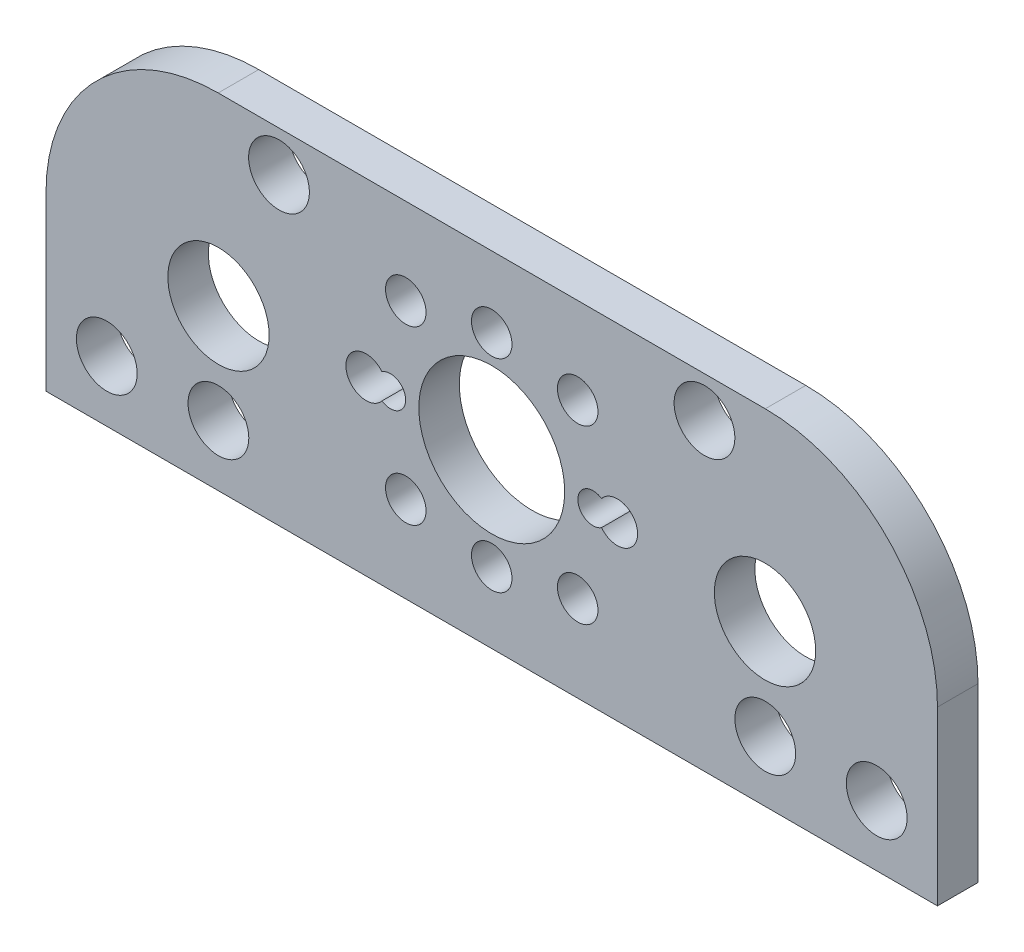
ISO-10303-21;
HEADER;
FILE_DESCRIPTION(('STEP AP214'),'2;1');
FILE_NAME('part.step','',(''),(''),'','','');
FILE_SCHEMA(('AUTOMOTIVE_DESIGN { 1 0 10303 214 1 1 1 1 }'));
ENDSEC;
DATA;
#1=APPLICATION_CONTEXT('core data for automotive mechanical design processes');
#2=APPLICATION_PROTOCOL_DEFINITION('international standard','automotive_design',2000,#1);
#3=PRODUCT_CONTEXT('',#1,'mechanical');
#4=PRODUCT('Part','Part','',(#3));
#5=PRODUCT_RELATED_PRODUCT_CATEGORY('part','',(#4));
#6=PRODUCT_DEFINITION_FORMATION('','',#4);
#7=PRODUCT_DEFINITION_CONTEXT('part definition',#1,'design');
#8=PRODUCT_DEFINITION('design','',#6,#7);
#9=PRODUCT_DEFINITION_SHAPE('','',#8);
#10=(LENGTH_UNIT() NAMED_UNIT(*) SI_UNIT(.MILLI.,.METRE.));
#11=(NAMED_UNIT(*) PLANE_ANGLE_UNIT() SI_UNIT($,.RADIAN.));
#12=(NAMED_UNIT(*) SI_UNIT($,.STERADIAN.) SOLID_ANGLE_UNIT());
#13=UNCERTAINTY_MEASURE_WITH_UNIT(LENGTH_MEASURE(1.E-05),#10,'distance_accuracy_value','');
#14=(GEOMETRIC_REPRESENTATION_CONTEXT(3) GLOBAL_UNCERTAINTY_ASSIGNED_CONTEXT((#13)) GLOBAL_UNIT_ASSIGNED_CONTEXT((#10,
#11,#12)) REPRESENTATION_CONTEXT('',''));
#15=CARTESIAN_POINT('',(0.,0.,0.));
#16=DIRECTION('',(0.,0.,1.));
#17=DIRECTION('',(1.,0.,0.));
#18=AXIS2_PLACEMENT_3D('',#15,#16,#17);
#19=CARTESIAN_POINT('',(22.,0.,-2.));
#20=DIRECTION('',(1.,0.,0.));
#21=DIRECTION('',(0.,1.,0.));
#22=AXIS2_PLACEMENT_3D('',#19,#20,#21);
#23=PLANE('',#22);
#24=DIRECTION('',(0.,1.,0.));
#25=VECTOR('',#24,1.);
#26=CARTESIAN_POINT('',(22.,0.,0.));
#27=LINE('',#26,#25);
#28=CARTESIAN_POINT('',(22.,-8.5,0.));
#29=VERTEX_POINT('',#28);
#30=CARTESIAN_POINT('',(22.,0.,0.));
#31=VERTEX_POINT('',#30);
#32=EDGE_CURVE('E156',#29,#31,#27,.T.);
#33=ORIENTED_EDGE('',*,*,#32,.F.);
#34=DIRECTION('',(0.,0.,1.));
#35=VECTOR('',#34,1.);
#36=CARTESIAN_POINT('',(22.,-8.5,-2.));
#37=LINE('',#36,#35);
#38=CARTESIAN_POINT('',(22.,-8.5,-2.));
#39=VERTEX_POINT('',#38);
#40=EDGE_CURVE('E11',#39,#29,#37,.T.);
#41=ORIENTED_EDGE('',*,*,#40,.F.);
#42=DIRECTION('',(0.,1.,0.));
#43=VECTOR('',#42,1.);
#44=CARTESIAN_POINT('',(22.,0.,-2.));
#45=LINE('',#44,#43);
#46=CARTESIAN_POINT('',(22.,0.,-2.));
#47=VERTEX_POINT('',#46);
#48=EDGE_CURVE('E159',#39,#47,#45,.T.);
#49=ORIENTED_EDGE('',*,*,#48,.T.);
#50=DIRECTION('',(0.,0.,1.));
#51=VECTOR('',#50,1.);
#52=CARTESIAN_POINT('',(22.,0.,-2.));
#53=LINE('',#52,#51);
#54=EDGE_CURVE('E44',#47,#31,#53,.T.);
#55=ORIENTED_EDGE('',*,*,#54,.T.);
#56=EDGE_LOOP('',(#33,#41,#49,#55));
#57=FACE_BOUND('',#56,.T.);
#58=ADVANCED_FACE('F41',(#57),#23,.T.);
#59=CARTESIAN_POINT('',(-22.,-8.5,-2.));
#60=DIRECTION('',(0.,-1.,0.));
#61=DIRECTION('',(0.,0.,-1.));
#62=AXIS2_PLACEMENT_3D('',#59,#60,#61);
#63=PLANE('',#62);
#64=DIRECTION('',(1.,0.,0.));
#65=VECTOR('',#64,1.);
#66=CARTESIAN_POINT('',(-22.,-8.5,0.));
#67=LINE('',#66,#65);
#68=CARTESIAN_POINT('',(-22.,-8.5,0.));
#69=VERTEX_POINT('',#68);
#70=EDGE_CURVE('E163',#69,#29,#67,.T.);
#71=ORIENTED_EDGE('',*,*,#70,.F.);
#72=DIRECTION('',(0.,0.,1.));
#73=VECTOR('',#72,1.);
#74=CARTESIAN_POINT('',(-22.,-8.5,-2.));
#75=LINE('',#74,#73);
#76=CARTESIAN_POINT('',(-22.,-8.5,-2.));
#77=VERTEX_POINT('',#76);
#78=EDGE_CURVE('E49',#77,#69,#75,.T.);
#79=ORIENTED_EDGE('',*,*,#78,.F.);
#80=DIRECTION('',(1.,0.,0.));
#81=VECTOR('',#80,1.);
#82=CARTESIAN_POINT('',(-22.,-8.5,-2.));
#83=LINE('',#82,#81);
#84=EDGE_CURVE('E175',#77,#39,#83,.T.);
#85=ORIENTED_EDGE('',*,*,#84,.T.);
#86=ORIENTED_EDGE('',*,*,#40,.T.);
#87=EDGE_LOOP('',(#71,#79,#85,#86));
#88=FACE_BOUND('',#87,.T.);
#89=ADVANCED_FACE('F211',(#88),#63,.T.);
#90=CARTESIAN_POINT('',(-22.,0.,-2.));
#91=DIRECTION('',(-1.,0.,0.));
#92=DIRECTION('',(0.,-1.,0.));
#93=AXIS2_PLACEMENT_3D('',#90,#91,#92);
#94=PLANE('',#93);
#95=DIRECTION('',(0.,-1.,0.));
#96=VECTOR('',#95,1.);
#97=CARTESIAN_POINT('',(-22.,0.,0.));
#98=LINE('',#97,#96);
#99=CARTESIAN_POINT('',(-22.,0.,0.));
#100=VERTEX_POINT('',#99);
#101=EDGE_CURVE('E189',#100,#69,#98,.T.);
#102=ORIENTED_EDGE('',*,*,#101,.F.);
#103=DIRECTION('',(0.,0.,1.));
#104=VECTOR('',#103,1.);
#105=CARTESIAN_POINT('',(-22.,0.,-2.));
#106=LINE('',#105,#104);
#107=CARTESIAN_POINT('',(-22.,0.,-2.));
#108=VERTEX_POINT('',#107);
#109=EDGE_CURVE('E195',#108,#100,#106,.T.);
#110=ORIENTED_EDGE('',*,*,#109,.F.);
#111=DIRECTION('',(0.,-1.,0.));
#112=VECTOR('',#111,1.);
#113=CARTESIAN_POINT('',(-22.,0.,-2.));
#114=LINE('',#113,#112);
#115=EDGE_CURVE('E172',#108,#77,#114,.T.);
#116=ORIENTED_EDGE('',*,*,#115,.T.);
#117=ORIENTED_EDGE('',*,*,#78,.T.);
#118=EDGE_LOOP('',(#102,#110,#116,#117));
#119=FACE_BOUND('',#118,.T.);
#120=ADVANCED_FACE('F224',(#119),#94,.T.);
#121=CARTESIAN_POINT('',(-13.5,0.,-2.));
#122=DIRECTION('',(0.,0.,1.));
#123=DIRECTION('',(1.,0.,0.));
#124=AXIS2_PLACEMENT_3D('',#121,#122,#123);
#125=CYLINDRICAL_SURFACE('',#124,8.5);
#126=CARTESIAN_POINT('',(-13.5,0.,0.));
#127=DIRECTION('',(0.,0.,1.));
#128=DIRECTION('',(-1.,0.,0.));
#129=AXIS2_PLACEMENT_3D('',#126,#127,#128);
#130=CIRCLE('',#129,8.5);
#131=CARTESIAN_POINT('',(-13.5,8.5,0.));
#132=VERTEX_POINT('',#131);
#133=EDGE_CURVE('E186',#132,#100,#130,.T.);
#134=ORIENTED_EDGE('',*,*,#133,.F.);
#135=DIRECTION('',(0.,0.,1.));
#136=VECTOR('',#135,1.);
#137=CARTESIAN_POINT('',(-13.5,8.5,-2.));
#138=LINE('',#137,#136);
#139=CARTESIAN_POINT('',(-13.5,8.5,-2.));
#140=VERTEX_POINT('',#139);
#141=EDGE_CURVE('E197',#140,#132,#138,.T.);
#142=ORIENTED_EDGE('',*,*,#141,.F.);
#143=CARTESIAN_POINT('',(-13.5,0.,-2.));
#144=DIRECTION('',(0.,0.,1.));
#145=DIRECTION('',(-1.,0.,0.));
#146=AXIS2_PLACEMENT_3D('',#143,#144,#145);
#147=CIRCLE('',#146,8.5);
#148=EDGE_CURVE('E169',#140,#108,#147,.T.);
#149=ORIENTED_EDGE('',*,*,#148,.T.);
#150=ORIENTED_EDGE('',*,*,#109,.T.);
#151=EDGE_LOOP('',(#134,#142,#149,#150));
#152=FACE_BOUND('',#151,.T.);
#153=ADVANCED_FACE('F222',(#152),#125,.T.);
#154=CARTESIAN_POINT('',(-13.5,8.5,-2.));
#155=DIRECTION('',(0.,1.,0.));
#156=DIRECTION('',(0.,0.,1.));
#157=AXIS2_PLACEMENT_3D('',#154,#155,#156);
#158=PLANE('',#157);
#159=DIRECTION('',(-1.,0.,0.));
#160=VECTOR('',#159,1.);
#161=CARTESIAN_POINT('',(-13.5,8.5,0.));
#162=LINE('',#161,#160);
#163=CARTESIAN_POINT('',(13.5,8.5,0.));
#164=VERTEX_POINT('',#163);
#165=EDGE_CURVE('E183',#164,#132,#162,.T.);
#166=ORIENTED_EDGE('',*,*,#165,.F.);
#167=DIRECTION('',(0.,0.,1.));
#168=VECTOR('',#167,1.);
#169=CARTESIAN_POINT('',(13.5,8.5,-2.));
#170=LINE('',#169,#168);
#171=CARTESIAN_POINT('',(13.5,8.5,-2.));
#172=VERTEX_POINT('',#171);
#173=EDGE_CURVE('E198',#172,#164,#170,.T.);
#174=ORIENTED_EDGE('',*,*,#173,.F.);
#175=DIRECTION('',(-1.,0.,0.));
#176=VECTOR('',#175,1.);
#177=CARTESIAN_POINT('',(-13.5,8.5,-2.));
#178=LINE('',#177,#176);
#179=EDGE_CURVE('E166',#172,#140,#178,.T.);
#180=ORIENTED_EDGE('',*,*,#179,.T.);
#181=ORIENTED_EDGE('',*,*,#141,.T.);
#182=EDGE_LOOP('',(#166,#174,#180,#181));
#183=FACE_BOUND('',#182,.T.);
#184=ADVANCED_FACE('F219',(#183),#158,.T.);
#185=CARTESIAN_POINT('',(13.5,0.,-2.));
#186=DIRECTION('',(0.,0.,1.));
#187=DIRECTION('',(1.,0.,0.));
#188=AXIS2_PLACEMENT_3D('',#185,#186,#187);
#189=CYLINDRICAL_SURFACE('',#188,8.5);
#190=CARTESIAN_POINT('',(13.5,0.,0.));
#191=DIRECTION('',(0.,0.,1.));
#192=DIRECTION('',(1.,0.,0.));
#193=AXIS2_PLACEMENT_3D('',#190,#191,#192);
#194=CIRCLE('',#193,8.5);
#195=EDGE_CURVE('E180',#31,#164,#194,.T.);
#196=ORIENTED_EDGE('',*,*,#195,.F.);
#197=ORIENTED_EDGE('',*,*,#54,.F.);
#198=CARTESIAN_POINT('',(13.5,0.,-2.));
#199=DIRECTION('',(0.,0.,1.));
#200=DIRECTION('',(1.,0.,0.));
#201=AXIS2_PLACEMENT_3D('',#198,#199,#200);
#202=CIRCLE('',#201,8.5);
#203=EDGE_CURVE('E162',#47,#172,#202,.T.);
#204=ORIENTED_EDGE('',*,*,#203,.T.);
#205=ORIENTED_EDGE('',*,*,#173,.T.);
#206=EDGE_LOOP('',(#196,#197,#204,#205));
#207=FACE_BOUND('',#206,.T.);
#208=ADVANCED_FACE('F206',(#207),#189,.T.);
#209=CARTESIAN_POINT('',(-13.5,0.,-2.));
#210=DIRECTION('',(0.,0.,-1.));
#211=DIRECTION('',(-1.,0.,0.));
#212=AXIS2_PLACEMENT_3D('',#209,#210,#211);
#213=PLANE('',#212);
#214=CARTESIAN_POINT('',(-19.,-5.5,-2.));
#215=DIRECTION('',(0.,0.,-1.));
#216=DIRECTION('',(-1.,0.,0.));
#217=AXIS2_PLACEMENT_3D('',#214,#215,#216);
#218=CIRCLE('',#217,1.5);
#219=CARTESIAN_POINT('',(-20.5,-5.5,-2.));
#220=VERTEX_POINT('',#219);
#221=EDGE_CURVE('E476',#220,#220,#218,.T.);
#222=ORIENTED_EDGE('',*,*,#221,.F.);
#223=EDGE_LOOP('',(#222));
#224=FACE_BOUND('',#223,.T.);
#225=CARTESIAN_POINT('',(13.5,-5.5,-2.));
#226=DIRECTION('',(0.,0.,-1.));
#227=DIRECTION('',(-1.,0.,0.));
#228=AXIS2_PLACEMENT_3D('',#225,#226,#227);
#229=CIRCLE('',#228,1.5);
#230=CARTESIAN_POINT('',(12.,-5.5,-2.));
#231=VERTEX_POINT('',#230);
#232=EDGE_CURVE('E509',#231,#231,#229,.T.);
#233=ORIENTED_EDGE('',*,*,#232,.F.);
#234=EDGE_LOOP('',(#233));
#235=FACE_BOUND('',#234,.T.);
#236=CARTESIAN_POINT('',(19.,-5.5,-2.));
#237=DIRECTION('',(0.,0.,-1.));
#238=DIRECTION('',(-1.,0.,0.));
#239=AXIS2_PLACEMENT_3D('',#236,#237,#238);
#240=CIRCLE('',#239,1.5);
#241=CARTESIAN_POINT('',(17.5,-5.5,-2.));
#242=VERTEX_POINT('',#241);
#243=EDGE_CURVE('E506',#242,#242,#240,.T.);
#244=ORIENTED_EDGE('',*,*,#243,.F.);
#245=EDGE_LOOP('',(#244));
#246=FACE_BOUND('',#245,.T.);
#247=CARTESIAN_POINT('',(-10.5,6.5,-2.));
#248=DIRECTION('',(0.,0.,-1.));
#249=DIRECTION('',(-1.,0.,0.));
#250=AXIS2_PLACEMENT_3D('',#247,#248,#249);
#251=CIRCLE('',#250,1.5);
#252=CARTESIAN_POINT('',(-12.,6.5,-2.));
#253=VERTEX_POINT('',#252);
#254=EDGE_CURVE('E503',#253,#253,#251,.T.);
#255=ORIENTED_EDGE('',*,*,#254,.F.);
#256=EDGE_LOOP('',(#255));
#257=FACE_BOUND('',#256,.T.);
#258=CARTESIAN_POINT('',(10.5,6.5,-2.));
#259=DIRECTION('',(0.,0.,-1.));
#260=DIRECTION('',(-1.,0.,0.));
#261=AXIS2_PLACEMENT_3D('',#258,#259,#260);
#262=CIRCLE('',#261,1.5);
#263=CARTESIAN_POINT('',(8.99999999999999,6.5,-2.));
#264=VERTEX_POINT('',#263);
#265=EDGE_CURVE('E484',#264,#264,#262,.T.);
#266=ORIENTED_EDGE('',*,*,#265,.F.);
#267=EDGE_LOOP('',(#266));
#268=FACE_BOUND('',#267,.T.);
#269=CARTESIAN_POINT('',(-13.490737563232,-5.5,-2.));
#270=DIRECTION('',(0.,0.,-1.));
#271=DIRECTION('',(-1.,0.,0.));
#272=AXIS2_PLACEMENT_3D('',#269,#270,#271);
#273=CIRCLE('',#272,1.5);
#274=CARTESIAN_POINT('',(-14.990737563232,-5.5,-2.));
#275=VERTEX_POINT('',#274);
#276=EDGE_CURVE('E480',#275,#275,#273,.T.);
#277=ORIENTED_EDGE('',*,*,#276,.F.);
#278=EDGE_LOOP('',(#277));
#279=FACE_BOUND('',#278,.T.);
#280=CARTESIAN_POINT('',(-13.4866600757934,-0.6,-2.));
#281=DIRECTION('',(0.,0.,1.));
#282=DIRECTION('',(1.,0.,0.));
#283=AXIS2_PLACEMENT_3D('',#280,#281,#282);
#284=CIRCLE('',#283,2.5);
#285=CARTESIAN_POINT('',(-10.9866600757934,-0.6,-2.));
#286=VERTEX_POINT('',#285);
#287=EDGE_CURVE('E514',#286,#286,#284,.T.);
#288=ORIENTED_EDGE('',*,*,#287,.T.);
#289=EDGE_LOOP('',(#288));
#290=FACE_BOUND('',#289,.T.);
#291=CARTESIAN_POINT('',(13.4866600757934,-0.6,-2.));
#292=DIRECTION('',(0.,0.,1.));
#293=DIRECTION('',(1.,0.,0.));
#294=AXIS2_PLACEMENT_3D('',#291,#292,#293);
#295=CIRCLE('',#294,2.49999999999999);
#296=CARTESIAN_POINT('',(15.9866600757934,-0.6,-2.));
#297=VERTEX_POINT('',#296);
#298=EDGE_CURVE('E513',#297,#297,#295,.T.);
#299=ORIENTED_EDGE('',*,*,#298,.T.);
#300=EDGE_LOOP('',(#299));
#301=FACE_BOUND('',#300,.T.);
#302=CARTESIAN_POINT('',(0.,5.,-2.));
#303=DIRECTION('',(0.,0.,1.));
#304=DIRECTION('',(1.,0.,0.));
#305=AXIS2_PLACEMENT_3D('',#302,#303,#304);
#306=CIRCLE('',#305,1.);
#307=CARTESIAN_POINT('',(1.,5.,-2.));
#308=VERTEX_POINT('',#307);
#309=EDGE_CURVE('E550',#308,#308,#306,.T.);
#310=ORIENTED_EDGE('',*,*,#309,.T.);
#311=EDGE_LOOP('',(#310));
#312=FACE_BOUND('',#311,.T.);
#313=CARTESIAN_POINT('',(0.,-5.,-2.));
#314=DIRECTION('',(0.,0.,1.));
#315=DIRECTION('',(1.,0.,0.));
#316=AXIS2_PLACEMENT_3D('',#313,#314,#315);
#317=CIRCLE('',#316,1.);
#318=CARTESIAN_POINT('',(1.,-5.,-2.));
#319=VERTEX_POINT('',#318);
#320=EDGE_CURVE('E556',#319,#319,#317,.T.);
#321=ORIENTED_EDGE('',*,*,#320,.T.);
#322=EDGE_LOOP('',(#321));
#323=FACE_BOUND('',#322,.T.);
#324=CARTESIAN_POINT('',(-4.24264068711928,4.24264068711929,-2.));
#325=DIRECTION('',(0.,0.,1.));
#326=DIRECTION('',(1.,0.,0.));
#327=AXIS2_PLACEMENT_3D('',#324,#325,#326);
#328=CIRCLE('',#327,1.);
#329=CARTESIAN_POINT('',(-3.24264068711928,4.24264068711929,-2.));
#330=VERTEX_POINT('',#329);
#331=EDGE_CURVE('E134',#330,#330,#328,.T.);
#332=ORIENTED_EDGE('',*,*,#331,.T.);
#333=EDGE_LOOP('',(#332));
#334=FACE_BOUND('',#333,.T.);
#335=CARTESIAN_POINT('',(-6.2,0.,-2.));
#336=DIRECTION('',(0.,0.,1.));
#337=DIRECTION('',(1.,0.,0.));
#338=AXIS2_PLACEMENT_3D('',#335,#336,#337);
#339=CIRCLE('',#338,1.);
#340=CARTESIAN_POINT('',(-5.41770833333333,0.622912311857687,-2.));
#341=VERTEX_POINT('',#340);
#342=CARTESIAN_POINT('',(-5.41770833333333,-0.622912311857687,-2.));
#343=VERTEX_POINT('',#342);
#344=EDGE_CURVE('E57',#341,#343,#339,.T.);
#345=ORIENTED_EDGE('',*,*,#344,.T.);
#346=CARTESIAN_POINT('',(-5.,0.,-2.));
#347=DIRECTION('',(0.,0.,1.));
#348=DIRECTION('',(1.,0.,0.));
#349=AXIS2_PLACEMENT_3D('',#346,#347,#348);
#350=CIRCLE('',#349,0.75);
#351=EDGE_CURVE('E140',#343,#341,#350,.T.);
#352=ORIENTED_EDGE('',*,*,#351,.T.);
#353=EDGE_LOOP('',(#345,#352));
#354=FACE_BOUND('',#353,.T.);
#355=CARTESIAN_POINT('',(4.24264068711928,-4.24264068711929,-2.));
#356=DIRECTION('',(0.,0.,1.));
#357=DIRECTION('',(1.,0.,0.));
#358=AXIS2_PLACEMENT_3D('',#355,#356,#357);
#359=CIRCLE('',#358,1.);
#360=CARTESIAN_POINT('',(5.24264068711928,-4.24264068711929,-2.));
#361=VERTEX_POINT('',#360);
#362=EDGE_CURVE('E517',#361,#361,#359,.T.);
#363=ORIENTED_EDGE('',*,*,#362,.T.);
#364=EDGE_LOOP('',(#363));
#365=FACE_BOUND('',#364,.T.);
#366=CARTESIAN_POINT('',(-4.24264068711928,-4.24264068711929,-2.));
#367=DIRECTION('',(0.,0.,1.));
#368=DIRECTION('',(1.,0.,0.));
#369=AXIS2_PLACEMENT_3D('',#366,#367,#368);
#370=CIRCLE('',#369,1.);
#371=CARTESIAN_POINT('',(-3.24264068711928,-4.24264068711929,-2.));
#372=VERTEX_POINT('',#371);
#373=EDGE_CURVE('E530',#372,#372,#370,.T.);
#374=ORIENTED_EDGE('',*,*,#373,.T.);
#375=EDGE_LOOP('',(#374));
#376=FACE_BOUND('',#375,.T.);
#377=CARTESIAN_POINT('',(0.,0.,-2.));
#378=DIRECTION('',(0.,0.,1.));
#379=DIRECTION('',(1.,0.,0.));
#380=AXIS2_PLACEMENT_3D('',#377,#378,#379);
#381=CIRCLE('',#380,3.6);
#382=CARTESIAN_POINT('',(3.6,0.,-2.));
#383=VERTEX_POINT('',#382);
#384=EDGE_CURVE('E541',#383,#383,#381,.T.);
#385=ORIENTED_EDGE('',*,*,#384,.T.);
#386=EDGE_LOOP('',(#385));
#387=FACE_BOUND('',#386,.T.);
#388=CARTESIAN_POINT('',(4.24264068711928,4.24264068711929,-2.));
#389=DIRECTION('',(0.,0.,1.));
#390=DIRECTION('',(1.,0.,0.));
#391=AXIS2_PLACEMENT_3D('',#388,#389,#390);
#392=CIRCLE('',#391,1.);
#393=CARTESIAN_POINT('',(5.24264068711928,4.24264068711929,-2.));
#394=VERTEX_POINT('',#393);
#395=EDGE_CURVE('E529',#394,#394,#392,.T.);
#396=ORIENTED_EDGE('',*,*,#395,.T.);
#397=EDGE_LOOP('',(#396));
#398=FACE_BOUND('',#397,.T.);
#399=CARTESIAN_POINT('',(6.2,0.,-2.));
#400=DIRECTION('',(0.,0.,1.));
#401=DIRECTION('',(1.,0.,0.));
#402=AXIS2_PLACEMENT_3D('',#399,#400,#401);
#403=CIRCLE('',#402,1.);
#404=CARTESIAN_POINT('',(5.41770833333333,-0.622912311857687,-2.));
#405=VERTEX_POINT('',#404);
#406=CARTESIAN_POINT('',(5.41770833333333,0.622912311857687,-2.));
#407=VERTEX_POINT('',#406);
#408=EDGE_CURVE('E65',#405,#407,#403,.T.);
#409=ORIENTED_EDGE('',*,*,#408,.T.);
#410=CARTESIAN_POINT('',(5.,0.,-2.));
#411=DIRECTION('',(0.,0.,1.));
#412=DIRECTION('',(1.,0.,0.));
#413=AXIS2_PLACEMENT_3D('',#410,#411,#412);
#414=CIRCLE('',#413,0.75);
#415=EDGE_CURVE('E144',#407,#405,#414,.T.);
#416=ORIENTED_EDGE('',*,*,#415,.T.);
#417=EDGE_LOOP('',(#409,#416));
#418=FACE_BOUND('',#417,.T.);
#419=ORIENTED_EDGE('',*,*,#48,.F.);
#420=ORIENTED_EDGE('',*,*,#84,.F.);
#421=ORIENTED_EDGE('',*,*,#115,.F.);
#422=ORIENTED_EDGE('',*,*,#148,.F.);
#423=ORIENTED_EDGE('',*,*,#179,.F.);
#424=ORIENTED_EDGE('',*,*,#203,.F.);
#425=EDGE_LOOP('',(#419,#420,#421,#422,#423,#424));
#426=FACE_BOUND('',#425,.T.);
#427=ADVANCED_FACE('F214',(#224,#235,#246,#257,#268,#279,#290,#301,#312,#323,#334,#354,#365,
#376,#387,#398,#418,#426),#213,.T.);
#428=CARTESIAN_POINT('',(-13.5,0.,0.));
#429=DIRECTION('',(0.,0.,-1.));
#430=DIRECTION('',(-1.,0.,0.));
#431=AXIS2_PLACEMENT_3D('',#428,#429,#430);
#432=PLANE('',#431);
#433=CARTESIAN_POINT('',(-19.,-5.5,0.));
#434=DIRECTION('',(0.,0.,1.));
#435=DIRECTION('',(1.,0.,0.));
#436=AXIS2_PLACEMENT_3D('',#433,#434,#435);
#437=CIRCLE('',#436,1.5);
#438=CARTESIAN_POINT('',(-17.5,-5.5,0.));
#439=VERTEX_POINT('',#438);
#440=EDGE_CURVE('E479',#439,#439,#437,.T.);
#441=ORIENTED_EDGE('',*,*,#440,.F.);
#442=EDGE_LOOP('',(#441));
#443=FACE_BOUND('',#442,.T.);
#444=CARTESIAN_POINT('',(13.5,-5.5,0.));
#445=DIRECTION('',(0.,0.,1.));
#446=DIRECTION('',(1.,0.,0.));
#447=AXIS2_PLACEMENT_3D('',#444,#445,#446);
#448=CIRCLE('',#447,1.5);
#449=CARTESIAN_POINT('',(15.,-5.5,0.));
#450=VERTEX_POINT('',#449);
#451=EDGE_CURVE('E490',#450,#450,#448,.T.);
#452=ORIENTED_EDGE('',*,*,#451,.F.);
#453=EDGE_LOOP('',(#452));
#454=FACE_BOUND('',#453,.T.);
#455=CARTESIAN_POINT('',(19.,-5.5,0.));
#456=DIRECTION('',(0.,0.,1.));
#457=DIRECTION('',(1.,0.,0.));
#458=AXIS2_PLACEMENT_3D('',#455,#456,#457);
#459=CIRCLE('',#458,1.5);
#460=CARTESIAN_POINT('',(20.5,-5.5,0.));
#461=VERTEX_POINT('',#460);
#462=EDGE_CURVE('E481',#461,#461,#459,.T.);
#463=ORIENTED_EDGE('',*,*,#462,.F.);
#464=EDGE_LOOP('',(#463));
#465=FACE_BOUND('',#464,.T.);
#466=CARTESIAN_POINT('',(-10.5,6.5,0.));
#467=DIRECTION('',(0.,0.,1.));
#468=DIRECTION('',(1.,0.,0.));
#469=AXIS2_PLACEMENT_3D('',#466,#467,#468);
#470=CIRCLE('',#469,1.5);
#471=CARTESIAN_POINT('',(-9.00000000000001,6.5,0.));
#472=VERTEX_POINT('',#471);
#473=EDGE_CURVE('E487',#472,#472,#470,.T.);
#474=ORIENTED_EDGE('',*,*,#473,.F.);
#475=EDGE_LOOP('',(#474));
#476=FACE_BOUND('',#475,.T.);
#477=CARTESIAN_POINT('',(10.5,6.5,0.));
#478=DIRECTION('',(0.,0.,1.));
#479=DIRECTION('',(1.,0.,0.));
#480=AXIS2_PLACEMENT_3D('',#477,#478,#479);
#481=CIRCLE('',#480,1.5);
#482=CARTESIAN_POINT('',(12.,6.5,0.));
#483=VERTEX_POINT('',#482);
#484=EDGE_CURVE('E494',#483,#483,#481,.T.);
#485=ORIENTED_EDGE('',*,*,#484,.F.);
#486=EDGE_LOOP('',(#485));
#487=FACE_BOUND('',#486,.T.);
#488=CARTESIAN_POINT('',(-13.490737563232,-5.5,0.));
#489=DIRECTION('',(0.,0.,1.));
#490=DIRECTION('',(1.,0.,0.));
#491=AXIS2_PLACEMENT_3D('',#488,#489,#490);
#492=CIRCLE('',#491,1.5);
#493=CARTESIAN_POINT('',(-11.990737563232,-5.5,0.));
#494=VERTEX_POINT('',#493);
#495=EDGE_CURVE('E493',#494,#494,#492,.T.);
#496=ORIENTED_EDGE('',*,*,#495,.F.);
#497=EDGE_LOOP('',(#496));
#498=FACE_BOUND('',#497,.T.);
#499=CARTESIAN_POINT('',(-13.4866600757934,-0.6,0.));
#500=DIRECTION('',(0.,0.,1.));
#501=DIRECTION('',(1.,0.,0.));
#502=AXIS2_PLACEMENT_3D('',#499,#500,#501);
#503=CIRCLE('',#502,2.5);
#504=CARTESIAN_POINT('',(-10.9866600757934,-0.6,0.));
#505=VERTEX_POINT('',#504);
#506=EDGE_CURVE('E518',#505,#505,#503,.T.);
#507=ORIENTED_EDGE('',*,*,#506,.F.);
#508=EDGE_LOOP('',(#507));
#509=FACE_BOUND('',#508,.T.);
#510=CARTESIAN_POINT('',(13.4866600757934,-0.6,0.));
#511=DIRECTION('',(0.,0.,1.));
#512=DIRECTION('',(1.,0.,0.));
#513=AXIS2_PLACEMENT_3D('',#510,#511,#512);
#514=CIRCLE('',#513,2.49999999999999);
#515=CARTESIAN_POINT('',(15.9866600757934,-0.6,0.));
#516=VERTEX_POINT('',#515);
#517=EDGE_CURVE('E521',#516,#516,#514,.T.);
#518=ORIENTED_EDGE('',*,*,#517,.F.);
#519=EDGE_LOOP('',(#518));
#520=FACE_BOUND('',#519,.T.);
#521=CARTESIAN_POINT('',(0.,5.,0.));
#522=DIRECTION('',(0.,0.,1.));
#523=DIRECTION('',(1.,0.,0.));
#524=AXIS2_PLACEMENT_3D('',#521,#522,#523);
#525=CIRCLE('',#524,1.);
#526=CARTESIAN_POINT('',(1.,5.,0.));
#527=VERTEX_POINT('',#526);
#528=EDGE_CURVE('E151',#527,#527,#525,.T.);
#529=ORIENTED_EDGE('',*,*,#528,.F.);
#530=EDGE_LOOP('',(#529));
#531=FACE_BOUND('',#530,.T.);
#532=CARTESIAN_POINT('',(0.,-5.,0.));
#533=DIRECTION('',(0.,0.,1.));
#534=DIRECTION('',(1.,0.,0.));
#535=AXIS2_PLACEMENT_3D('',#532,#533,#534);
#536=CIRCLE('',#535,1.);
#537=CARTESIAN_POINT('',(1.,-5.,0.));
#538=VERTEX_POINT('',#537);
#539=EDGE_CURVE('E553',#538,#538,#536,.T.);
#540=ORIENTED_EDGE('',*,*,#539,.F.);
#541=EDGE_LOOP('',(#540));
#542=FACE_BOUND('',#541,.T.);
#543=CARTESIAN_POINT('',(-4.24264068711928,4.24264068711929,0.));
#544=DIRECTION('',(0.,0.,1.));
#545=DIRECTION('',(1.,0.,0.));
#546=AXIS2_PLACEMENT_3D('',#543,#544,#545);
#547=CIRCLE('',#546,1.);
#548=CARTESIAN_POINT('',(-3.24264068711928,4.24264068711929,0.));
#549=VERTEX_POINT('',#548);
#550=EDGE_CURVE('E137',#549,#549,#547,.T.);
#551=ORIENTED_EDGE('',*,*,#550,.F.);
#552=EDGE_LOOP('',(#551));
#553=FACE_BOUND('',#552,.T.);
#554=CARTESIAN_POINT('',(-5.,0.,0.));
#555=DIRECTION('',(0.,0.,1.));
#556=DIRECTION('',(1.,0.,0.));
#557=AXIS2_PLACEMENT_3D('',#554,#555,#556);
#558=CIRCLE('',#557,0.75);
#559=CARTESIAN_POINT('',(-5.41770833333333,-0.622912311857687,0.));
#560=VERTEX_POINT('',#559);
#561=CARTESIAN_POINT('',(-5.41770833333333,0.622912311857687,0.));
#562=VERTEX_POINT('',#561);
#563=EDGE_CURVE('E128',#560,#562,#558,.T.);
#564=ORIENTED_EDGE('',*,*,#563,.F.);
#565=CARTESIAN_POINT('',(-6.2,0.,0.));
#566=DIRECTION('',(0.,0.,1.));
#567=DIRECTION('',(1.,0.,0.));
#568=AXIS2_PLACEMENT_3D('',#565,#566,#567);
#569=CIRCLE('',#568,1.);
#570=EDGE_CURVE('E119',#562,#560,#569,.T.);
#571=ORIENTED_EDGE('',*,*,#570,.F.);
#572=EDGE_LOOP('',(#564,#571));
#573=FACE_BOUND('',#572,.T.);
#574=CARTESIAN_POINT('',(4.24264068711928,-4.24264068711929,0.));
#575=DIRECTION('',(0.,0.,1.));
#576=DIRECTION('',(1.,0.,0.));
#577=AXIS2_PLACEMENT_3D('',#574,#575,#576);
#578=CIRCLE('',#577,1.);
#579=CARTESIAN_POINT('',(5.24264068711928,-4.24264068711929,0.));
#580=VERTEX_POINT('',#579);
#581=EDGE_CURVE('E533',#580,#580,#578,.T.);
#582=ORIENTED_EDGE('',*,*,#581,.F.);
#583=EDGE_LOOP('',(#582));
#584=FACE_BOUND('',#583,.T.);
#585=CARTESIAN_POINT('',(-4.24264068711928,-4.24264068711929,0.));
#586=DIRECTION('',(0.,0.,1.));
#587=DIRECTION('',(1.,0.,0.));
#588=AXIS2_PLACEMENT_3D('',#585,#586,#587);
#589=CIRCLE('',#588,1.);
#590=CARTESIAN_POINT('',(-3.24264068711928,-4.24264068711929,0.));
#591=VERTEX_POINT('',#590);
#592=EDGE_CURVE('E526',#591,#591,#589,.T.);
#593=ORIENTED_EDGE('',*,*,#592,.F.);
#594=EDGE_LOOP('',(#593));
#595=FACE_BOUND('',#594,.T.);
#596=CARTESIAN_POINT('',(0.,0.,0.));
#597=DIRECTION('',(0.,0.,1.));
#598=DIRECTION('',(1.,0.,0.));
#599=AXIS2_PLACEMENT_3D('',#596,#597,#598);
#600=CIRCLE('',#599,3.6);
#601=CARTESIAN_POINT('',(3.6,0.,0.));
#602=VERTEX_POINT('',#601);
#603=EDGE_CURVE('E125',#602,#602,#600,.T.);
#604=ORIENTED_EDGE('',*,*,#603,.F.);
#605=EDGE_LOOP('',(#604));
#606=FACE_BOUND('',#605,.T.);
#607=CARTESIAN_POINT('',(4.24264068711928,4.24264068711929,0.));
#608=DIRECTION('',(0.,0.,1.));
#609=DIRECTION('',(1.,0.,0.));
#610=AXIS2_PLACEMENT_3D('',#607,#608,#609);
#611=CIRCLE('',#610,1.);
#612=CARTESIAN_POINT('',(5.24264068711928,4.24264068711929,0.));
#613=VERTEX_POINT('',#612);
#614=EDGE_CURVE('E538',#613,#613,#611,.T.);
#615=ORIENTED_EDGE('',*,*,#614,.F.);
#616=EDGE_LOOP('',(#615));
#617=FACE_BOUND('',#616,.T.);
#618=CARTESIAN_POINT('',(5.,0.,0.));
#619=DIRECTION('',(0.,0.,1.));
#620=DIRECTION('',(1.,0.,0.));
#621=AXIS2_PLACEMENT_3D('',#618,#619,#620);
#622=CIRCLE('',#621,0.75);
#623=CARTESIAN_POINT('',(5.41770833333333,0.622912311857687,0.));
#624=VERTEX_POINT('',#623);
#625=CARTESIAN_POINT('',(5.41770833333333,-0.622912311857687,0.));
#626=VERTEX_POINT('',#625);
#627=EDGE_CURVE('E145',#624,#626,#622,.T.);
#628=ORIENTED_EDGE('',*,*,#627,.F.);
#629=CARTESIAN_POINT('',(6.2,0.,0.));
#630=DIRECTION('',(0.,0.,1.));
#631=DIRECTION('',(1.,0.,0.));
#632=AXIS2_PLACEMENT_3D('',#629,#630,#631);
#633=CIRCLE('',#632,1.);
#634=EDGE_CURVE('E149',#626,#624,#633,.T.);
#635=ORIENTED_EDGE('',*,*,#634,.F.);
#636=EDGE_LOOP('',(#628,#635));
#637=FACE_BOUND('',#636,.T.);
#638=ORIENTED_EDGE('',*,*,#32,.T.);
#639=ORIENTED_EDGE('',*,*,#195,.T.);
#640=ORIENTED_EDGE('',*,*,#165,.T.);
#641=ORIENTED_EDGE('',*,*,#133,.T.);
#642=ORIENTED_EDGE('',*,*,#101,.T.);
#643=ORIENTED_EDGE('',*,*,#70,.T.);
#644=EDGE_LOOP('',(#638,#639,#640,#641,#642,#643));
#645=FACE_BOUND('',#644,.T.);
#646=ADVANCED_FACE('F132',(#443,#454,#465,#476,#487,#498,#509,#520,#531,#542,#553,#573,#584,
#595,#606,#617,#637,#645),#432,.F.);
#647=CARTESIAN_POINT('',(6.2,0.,-2.));
#648=DIRECTION('',(0.,0.,1.));
#649=DIRECTION('',(1.,0.,0.));
#650=AXIS2_PLACEMENT_3D('',#647,#648,#649);
#651=CYLINDRICAL_SURFACE('',#650,1.);
#652=ORIENTED_EDGE('',*,*,#634,.T.);
#653=DIRECTION('',(0.,0.,1.));
#654=VECTOR('',#653,1.);
#655=CARTESIAN_POINT('',(5.41770833333333,0.622912311857687,-2.));
#656=LINE('',#655,#654);
#657=EDGE_CURVE('E148',#407,#624,#656,.T.);
#658=ORIENTED_EDGE('',*,*,#657,.F.);
#659=ORIENTED_EDGE('',*,*,#408,.F.);
#660=DIRECTION('',(0.,0.,1.));
#661=VECTOR('',#660,1.);
#662=CARTESIAN_POINT('',(5.41770833333333,-0.622912311857687,-2.));
#663=LINE('',#662,#661);
#664=EDGE_CURVE('E154',#405,#626,#663,.T.);
#665=ORIENTED_EDGE('',*,*,#664,.T.);
#666=EDGE_LOOP('',(#652,#658,#659,#665));
#667=FACE_BOUND('',#666,.T.);
#668=ADVANCED_FACE('F287',(#667),#651,.F.);
#669=CARTESIAN_POINT('',(5.,0.,-2.));
#670=DIRECTION('',(0.,0.,1.));
#671=DIRECTION('',(1.,0.,0.));
#672=AXIS2_PLACEMENT_3D('',#669,#670,#671);
#673=CYLINDRICAL_SURFACE('',#672,0.75);
#674=ORIENTED_EDGE('',*,*,#627,.T.);
#675=ORIENTED_EDGE('',*,*,#664,.F.);
#676=ORIENTED_EDGE('',*,*,#415,.F.);
#677=ORIENTED_EDGE('',*,*,#657,.T.);
#678=EDGE_LOOP('',(#674,#675,#676,#677));
#679=FACE_BOUND('',#678,.T.);
#680=ADVANCED_FACE('F297',(#679),#673,.F.);
#681=CARTESIAN_POINT('',(4.24264068711928,4.24264068711929,-2.));
#682=DIRECTION('',(0.,0.,1.));
#683=DIRECTION('',(1.,0.,0.));
#684=AXIS2_PLACEMENT_3D('',#681,#682,#683);
#685=CYLINDRICAL_SURFACE('',#684,1.);
#686=ORIENTED_EDGE('',*,*,#395,.F.);
#687=EDGE_LOOP('',(#686));
#688=FACE_BOUND('',#687,.T.);
#689=ORIENTED_EDGE('',*,*,#614,.T.);
#690=EDGE_LOOP('',(#689));
#691=FACE_BOUND('',#690,.T.);
#692=ADVANCED_FACE('F306',(#688,#691),#685,.F.);
#693=CARTESIAN_POINT('',(0.,0.,-2.));
#694=DIRECTION('',(0.,0.,1.));
#695=DIRECTION('',(1.,0.,0.));
#696=AXIS2_PLACEMENT_3D('',#693,#694,#695);
#697=CYLINDRICAL_SURFACE('',#696,3.6);
#698=ORIENTED_EDGE('',*,*,#384,.F.);
#699=EDGE_LOOP('',(#698));
#700=FACE_BOUND('',#699,.T.);
#701=ORIENTED_EDGE('',*,*,#603,.T.);
#702=EDGE_LOOP('',(#701));
#703=FACE_BOUND('',#702,.T.);
#704=ADVANCED_FACE('F316',(#700,#703),#697,.F.);
#705=CARTESIAN_POINT('',(-4.24264068711928,-4.24264068711929,-2.));
#706=DIRECTION('',(0.,0.,1.));
#707=DIRECTION('',(1.,0.,0.));
#708=AXIS2_PLACEMENT_3D('',#705,#706,#707);
#709=CYLINDRICAL_SURFACE('',#708,1.);
#710=ORIENTED_EDGE('',*,*,#373,.F.);
#711=EDGE_LOOP('',(#710));
#712=FACE_BOUND('',#711,.T.);
#713=ORIENTED_EDGE('',*,*,#592,.T.);
#714=EDGE_LOOP('',(#713));
#715=FACE_BOUND('',#714,.T.);
#716=ADVANCED_FACE('F326',(#712,#715),#709,.F.);
#717=CARTESIAN_POINT('',(4.24264068711928,-4.24264068711929,-2.));
#718=DIRECTION('',(0.,0.,1.));
#719=DIRECTION('',(1.,0.,0.));
#720=AXIS2_PLACEMENT_3D('',#717,#718,#719);
#721=CYLINDRICAL_SURFACE('',#720,1.);
#722=ORIENTED_EDGE('',*,*,#362,.F.);
#723=EDGE_LOOP('',(#722));
#724=FACE_BOUND('',#723,.T.);
#725=ORIENTED_EDGE('',*,*,#581,.T.);
#726=EDGE_LOOP('',(#725));
#727=FACE_BOUND('',#726,.T.);
#728=ADVANCED_FACE('F336',(#724,#727),#721,.F.);
#729=CARTESIAN_POINT('',(-6.2,0.,-2.));
#730=DIRECTION('',(0.,0.,1.));
#731=DIRECTION('',(1.,0.,0.));
#732=AXIS2_PLACEMENT_3D('',#729,#730,#731);
#733=CYLINDRICAL_SURFACE('',#732,1.);
#734=ORIENTED_EDGE('',*,*,#570,.T.);
#735=DIRECTION('',(0.,0.,1.));
#736=VECTOR('',#735,1.);
#737=CARTESIAN_POINT('',(-5.41770833333333,-0.622912311857687,-2.));
#738=LINE('',#737,#736);
#739=EDGE_CURVE('E124',#343,#560,#738,.T.);
#740=ORIENTED_EDGE('',*,*,#739,.F.);
#741=ORIENTED_EDGE('',*,*,#344,.F.);
#742=DIRECTION('',(0.,0.,1.));
#743=VECTOR('',#742,1.);
#744=CARTESIAN_POINT('',(-5.41770833333333,0.622912311857687,-2.));
#745=LINE('',#744,#743);
#746=EDGE_CURVE('E115',#341,#562,#745,.T.);
#747=ORIENTED_EDGE('',*,*,#746,.T.);
#748=EDGE_LOOP('',(#734,#740,#741,#747));
#749=FACE_BOUND('',#748,.T.);
#750=ADVANCED_FACE('F117',(#749),#733,.F.);
#751=CARTESIAN_POINT('',(-5.,0.,-2.));
#752=DIRECTION('',(0.,0.,1.));
#753=DIRECTION('',(1.,0.,0.));
#754=AXIS2_PLACEMENT_3D('',#751,#752,#753);
#755=CYLINDRICAL_SURFACE('',#754,0.75);
#756=ORIENTED_EDGE('',*,*,#563,.T.);
#757=ORIENTED_EDGE('',*,*,#746,.F.);
#758=ORIENTED_EDGE('',*,*,#351,.F.);
#759=ORIENTED_EDGE('',*,*,#739,.T.);
#760=EDGE_LOOP('',(#756,#757,#758,#759));
#761=FACE_BOUND('',#760,.T.);
#762=ADVANCED_FACE('F129',(#761),#755,.F.);
#763=CARTESIAN_POINT('',(-4.24264068711928,4.24264068711929,-2.));
#764=DIRECTION('',(0.,0.,1.));
#765=DIRECTION('',(1.,0.,0.));
#766=AXIS2_PLACEMENT_3D('',#763,#764,#765);
#767=CYLINDRICAL_SURFACE('',#766,1.);
#768=ORIENTED_EDGE('',*,*,#331,.F.);
#769=EDGE_LOOP('',(#768));
#770=FACE_BOUND('',#769,.T.);
#771=ORIENTED_EDGE('',*,*,#550,.T.);
#772=EDGE_LOOP('',(#771));
#773=FACE_BOUND('',#772,.T.);
#774=ADVANCED_FACE('F363',(#770,#773),#767,.F.);
#775=CARTESIAN_POINT('',(0.,-5.,-2.));
#776=DIRECTION('',(0.,0.,1.));
#777=DIRECTION('',(1.,0.,0.));
#778=AXIS2_PLACEMENT_3D('',#775,#776,#777);
#779=CYLINDRICAL_SURFACE('',#778,1.);
#780=ORIENTED_EDGE('',*,*,#320,.F.);
#781=EDGE_LOOP('',(#780));
#782=FACE_BOUND('',#781,.T.);
#783=ORIENTED_EDGE('',*,*,#539,.T.);
#784=EDGE_LOOP('',(#783));
#785=FACE_BOUND('',#784,.T.);
#786=ADVANCED_FACE('F372',(#782,#785),#779,.F.);
#787=CARTESIAN_POINT('',(0.,5.,-2.));
#788=DIRECTION('',(0.,0.,1.));
#789=DIRECTION('',(1.,0.,0.));
#790=AXIS2_PLACEMENT_3D('',#787,#788,#789);
#791=CYLINDRICAL_SURFACE('',#790,1.);
#792=ORIENTED_EDGE('',*,*,#309,.F.);
#793=EDGE_LOOP('',(#792));
#794=FACE_BOUND('',#793,.T.);
#795=ORIENTED_EDGE('',*,*,#528,.T.);
#796=EDGE_LOOP('',(#795));
#797=FACE_BOUND('',#796,.T.);
#798=ADVANCED_FACE('F382',(#794,#797),#791,.F.);
#799=CARTESIAN_POINT('',(13.4866600757934,-0.6,-2.));
#800=DIRECTION('',(0.,0.,1.));
#801=DIRECTION('',(1.,0.,0.));
#802=AXIS2_PLACEMENT_3D('',#799,#800,#801);
#803=CYLINDRICAL_SURFACE('',#802,2.49999999999999);
#804=ORIENTED_EDGE('',*,*,#298,.F.);
#805=EDGE_LOOP('',(#804));
#806=FACE_BOUND('',#805,.T.);
#807=ORIENTED_EDGE('',*,*,#517,.T.);
#808=EDGE_LOOP('',(#807));
#809=FACE_BOUND('',#808,.T.);
#810=ADVANCED_FACE('F392',(#806,#809),#803,.F.);
#811=CARTESIAN_POINT('',(-13.4866600757934,-0.6,-2.));
#812=DIRECTION('',(0.,0.,1.));
#813=DIRECTION('',(1.,0.,0.));
#814=AXIS2_PLACEMENT_3D('',#811,#812,#813);
#815=CYLINDRICAL_SURFACE('',#814,2.5);
#816=ORIENTED_EDGE('',*,*,#287,.F.);
#817=EDGE_LOOP('',(#816));
#818=FACE_BOUND('',#817,.T.);
#819=ORIENTED_EDGE('',*,*,#506,.T.);
#820=EDGE_LOOP('',(#819));
#821=FACE_BOUND('',#820,.T.);
#822=ADVANCED_FACE('F402',(#818,#821),#815,.F.);
#823=CARTESIAN_POINT('',(-13.490737563232,-5.5,-10.));
#824=DIRECTION('',(0.,0.,1.));
#825=DIRECTION('',(1.,0.,0.));
#826=AXIS2_PLACEMENT_3D('',#823,#824,#825);
#827=CYLINDRICAL_SURFACE('',#826,1.5);
#828=ORIENTED_EDGE('',*,*,#276,.T.);
#829=EDGE_LOOP('',(#828));
#830=FACE_BOUND('',#829,.T.);
#831=ORIENTED_EDGE('',*,*,#495,.T.);
#832=EDGE_LOOP('',(#831));
#833=FACE_BOUND('',#832,.T.);
#834=ADVANCED_FACE('F411',(#830,#833),#827,.F.);
#835=CARTESIAN_POINT('',(10.5,6.5,-10.));
#836=DIRECTION('',(0.,0.,1.));
#837=DIRECTION('',(1.,0.,0.));
#838=AXIS2_PLACEMENT_3D('',#835,#836,#837);
#839=CYLINDRICAL_SURFACE('',#838,1.5);
#840=ORIENTED_EDGE('',*,*,#265,.T.);
#841=EDGE_LOOP('',(#840));
#842=FACE_BOUND('',#841,.T.);
#843=ORIENTED_EDGE('',*,*,#484,.T.);
#844=EDGE_LOOP('',(#843));
#845=FACE_BOUND('',#844,.T.);
#846=ADVANCED_FACE('F420',(#842,#845),#839,.F.);
#847=CARTESIAN_POINT('',(-10.5,6.5,-10.));
#848=DIRECTION('',(0.,0.,1.));
#849=DIRECTION('',(1.,0.,0.));
#850=AXIS2_PLACEMENT_3D('',#847,#848,#849);
#851=CYLINDRICAL_SURFACE('',#850,1.5);
#852=ORIENTED_EDGE('',*,*,#254,.T.);
#853=EDGE_LOOP('',(#852));
#854=FACE_BOUND('',#853,.T.);
#855=ORIENTED_EDGE('',*,*,#473,.T.);
#856=EDGE_LOOP('',(#855));
#857=FACE_BOUND('',#856,.T.);
#858=ADVANCED_FACE('F430',(#854,#857),#851,.F.);
#859=CARTESIAN_POINT('',(19.,-5.5,-10.));
#860=DIRECTION('',(0.,0.,1.));
#861=DIRECTION('',(1.,0.,0.));
#862=AXIS2_PLACEMENT_3D('',#859,#860,#861);
#863=CYLINDRICAL_SURFACE('',#862,1.5);
#864=ORIENTED_EDGE('',*,*,#243,.T.);
#865=EDGE_LOOP('',(#864));
#866=FACE_BOUND('',#865,.T.);
#867=ORIENTED_EDGE('',*,*,#462,.T.);
#868=EDGE_LOOP('',(#867));
#869=FACE_BOUND('',#868,.T.);
#870=ADVANCED_FACE('F440',(#866,#869),#863,.F.);
#871=CARTESIAN_POINT('',(13.5,-5.5,-10.));
#872=DIRECTION('',(0.,0.,1.));
#873=DIRECTION('',(1.,0.,0.));
#874=AXIS2_PLACEMENT_3D('',#871,#872,#873);
#875=CYLINDRICAL_SURFACE('',#874,1.5);
#876=ORIENTED_EDGE('',*,*,#232,.T.);
#877=EDGE_LOOP('',(#876));
#878=FACE_BOUND('',#877,.T.);
#879=ORIENTED_EDGE('',*,*,#451,.T.);
#880=EDGE_LOOP('',(#879));
#881=FACE_BOUND('',#880,.T.);
#882=ADVANCED_FACE('F450',(#878,#881),#875,.F.);
#883=CARTESIAN_POINT('',(-19.,-5.5,-10.));
#884=DIRECTION('',(0.,0.,1.));
#885=DIRECTION('',(1.,0.,0.));
#886=AXIS2_PLACEMENT_3D('',#883,#884,#885);
#887=CYLINDRICAL_SURFACE('',#886,1.5);
#888=ORIENTED_EDGE('',*,*,#221,.T.);
#889=EDGE_LOOP('',(#888));
#890=FACE_BOUND('',#889,.T.);
#891=ORIENTED_EDGE('',*,*,#440,.T.);
#892=EDGE_LOOP('',(#891));
#893=FACE_BOUND('',#892,.T.);
#894=ADVANCED_FACE('F460',(#890,#893),#887,.F.);
#895=CLOSED_SHELL('',(#58,#89,#120,#153,#184,#208,#427,#646,#668,#680,#692,#704,#716,#728,#750,
#762,#774,#786,#798,#810,#822,#834,#846,#858,#870,#882,#894));
#896=MANIFOLD_SOLID_BREP('B2',#895);
#897=ADVANCED_BREP_SHAPE_REPRESENTATION('',(#18,#896),#14);
#898=SHAPE_DEFINITION_REPRESENTATION(#9,#897);
ENDSEC;
END-ISO-10303-21;
